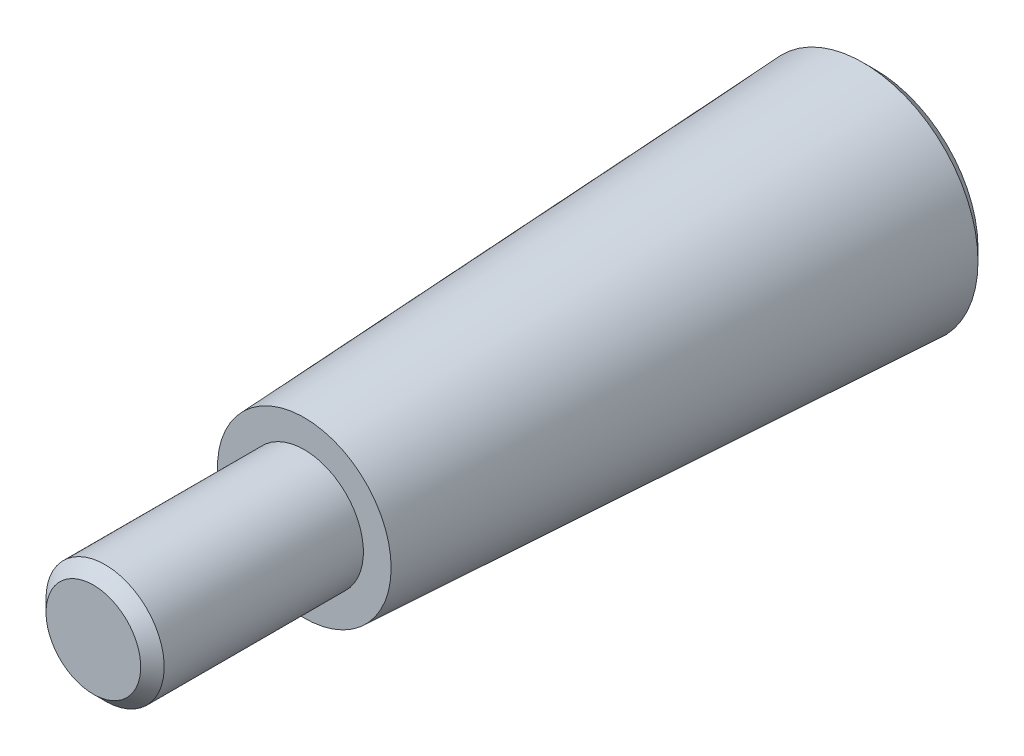
ISO-10303-21;
HEADER;
FILE_DESCRIPTION(('STEP AP214'),'2;1');
FILE_NAME('part.step','',(''),(''),'','','');
FILE_SCHEMA(('AUTOMOTIVE_DESIGN { 1 0 10303 214 1 1 1 1 }'));
ENDSEC;
DATA;
#1=APPLICATION_CONTEXT('core data for automotive mechanical design processes');
#2=APPLICATION_PROTOCOL_DEFINITION('international standard','automotive_design',2000,#1);
#3=PRODUCT_CONTEXT('',#1,'mechanical');
#4=PRODUCT('Part','Part','',(#3));
#5=PRODUCT_RELATED_PRODUCT_CATEGORY('part','',(#4));
#6=PRODUCT_DEFINITION_FORMATION('','',#4);
#7=PRODUCT_DEFINITION_CONTEXT('part definition',#1,'design');
#8=PRODUCT_DEFINITION('design','',#6,#7);
#9=PRODUCT_DEFINITION_SHAPE('','',#8);
#10=(LENGTH_UNIT() NAMED_UNIT(*) SI_UNIT(.MILLI.,.METRE.));
#11=(NAMED_UNIT(*) PLANE_ANGLE_UNIT() SI_UNIT($,.RADIAN.));
#12=(NAMED_UNIT(*) SI_UNIT($,.STERADIAN.) SOLID_ANGLE_UNIT());
#13=UNCERTAINTY_MEASURE_WITH_UNIT(LENGTH_MEASURE(1.E-05),#10,'distance_accuracy_value','');
#14=(GEOMETRIC_REPRESENTATION_CONTEXT(3) GLOBAL_UNCERTAINTY_ASSIGNED_CONTEXT((#13)) GLOBAL_UNIT_ASSIGNED_CONTEXT((#10,
#11,#12)) REPRESENTATION_CONTEXT('',''));
#15=CARTESIAN_POINT('',(0.,0.,0.));
#16=DIRECTION('',(0.,0.,1.));
#17=DIRECTION('',(1.,0.,0.));
#18=AXIS2_PLACEMENT_3D('',#15,#16,#17);
#19=CARTESIAN_POINT('',(0.,0.,0.));
#20=DIRECTION('',(0.,0.,1.));
#21=DIRECTION('',(1.,0.,0.));
#22=AXIS2_PLACEMENT_3D('',#19,#20,#21);
#23=PLANE('',#22);
#24=CARTESIAN_POINT('',(0.,0.,0.));
#25=DIRECTION('',(0.,0.,-1.));
#26=DIRECTION('',(-1.,0.,0.));
#27=AXIS2_PLACEMENT_3D('',#24,#25,#26);
#28=CIRCLE('',#27,3.81635);
#29=CARTESIAN_POINT('',(-3.81635,0.,0.));
#30=VERTEX_POINT('',#29);
#31=EDGE_CURVE('E66',#30,#30,#28,.T.);
#32=ORIENTED_EDGE('',*,*,#31,.F.);
#33=EDGE_LOOP('',(#32));
#34=FACE_BOUND('',#33,.T.);
#35=ADVANCED_FACE('F47',(#34),#23,.T.);
#36=CARTESIAN_POINT('',(0.,0.,0.));
#37=DIRECTION('',(0.,0.,-1.));
#38=DIRECTION('',(-1.,0.,0.));
#39=AXIS2_PLACEMENT_3D('',#36,#37,#38);
#40=CYLINDRICAL_SURFACE('',#39,4.7625);
#41=CARTESIAN_POINT('',(0.,0.,-17.));
#42=DIRECTION('',(0.,0.,-1.));
#43=DIRECTION('',(-1.,0.,0.));
#44=AXIS2_PLACEMENT_3D('',#41,#42,#43);
#45=CIRCLE('',#44,4.7625);
#46=CARTESIAN_POINT('',(-4.7625,0.,-17.));
#47=VERTEX_POINT('',#46);
#48=EDGE_CURVE('E61',#47,#47,#45,.T.);
#49=ORIENTED_EDGE('',*,*,#48,.F.);
#50=EDGE_LOOP('',(#49));
#51=FACE_BOUND('',#50,.T.);
#52=CARTESIAN_POINT('',(0.,0.,-0.946149999999986));
#53=DIRECTION('',(0.,0.,-1.));
#54=DIRECTION('',(-1.,0.,0.));
#55=AXIS2_PLACEMENT_3D('',#52,#53,#54);
#56=CIRCLE('',#55,4.7625);
#57=CARTESIAN_POINT('',(-4.7625,0.,-0.946149999999986));
#58=VERTEX_POINT('',#57);
#59=EDGE_CURVE('E72',#58,#58,#56,.T.);
#60=ORIENTED_EDGE('',*,*,#59,.T.);
#61=EDGE_LOOP('',(#60));
#62=FACE_BOUND('',#61,.T.);
#63=ADVANCED_FACE('F96',(#51,#62),#40,.T.);
#64=CARTESIAN_POINT('',(0.,0.,0.));
#65=DIRECTION('',(0.,0.,-1.));
#66=DIRECTION('',(-1.,0.,0.));
#67=AXIS2_PLACEMENT_3D('',#64,#65,#66);
#68=CONICAL_SURFACE('',#67,3.81635,0.785398163397455);
#69=ORIENTED_EDGE('',*,*,#59,.F.);
#70=EDGE_LOOP('',(#69));
#71=FACE_BOUND('',#70,.T.);
#72=ORIENTED_EDGE('',*,*,#31,.T.);
#73=EDGE_LOOP('',(#72));
#74=FACE_BOUND('',#73,.T.);
#75=ADVANCED_FACE('F92',(#71,#74),#68,.T.);
#76=CARTESIAN_POINT('',(0.,0.,-17.));
#77=DIRECTION('',(0.,0.,-1.));
#78=DIRECTION('',(-1.,0.,0.));
#79=AXIS2_PLACEMENT_3D('',#76,#77,#78);
#80=PLANE('',#79);
#81=ORIENTED_EDGE('',*,*,#48,.T.);
#82=EDGE_LOOP('',(#81));
#83=FACE_BOUND('',#82,.T.);
#84=CARTESIAN_POINT('',(0.,0.,-17.));
#85=DIRECTION('',(0.,0.,1.));
#86=DIRECTION('',(1.,0.,0.));
#87=AXIS2_PLACEMENT_3D('',#84,#85,#86);
#88=CIRCLE('',#87,7.);
#89=CARTESIAN_POINT('',(7.,0.,-17.));
#90=VERTEX_POINT('',#89);
#91=EDGE_CURVE('E76',#90,#90,#88,.T.);
#92=ORIENTED_EDGE('',*,*,#91,.T.);
#93=EDGE_LOOP('',(#92));
#94=FACE_BOUND('',#93,.T.);
#95=ADVANCED_FACE('F81',(#83,#94),#80,.F.);
#96=CARTESIAN_POINT('',(0.,0.,-63.));
#97=DIRECTION('',(0.,0.,-1.));
#98=DIRECTION('',(-1.,0.,0.));
#99=AXIS2_PLACEMENT_3D('',#96,#97,#98);
#100=CONICAL_SURFACE('',#99,9.3,0.0499583957219427);
#101=CARTESIAN_POINT('',(0.,0.,-62.047619047619));
#102=DIRECTION('',(0.,0.,1.));
#103=DIRECTION('',(1.,0.,0.));
#104=AXIS2_PLACEMENT_3D('',#101,#102,#103);
#105=CIRCLE('',#104,9.25238095238095);
#106=CARTESIAN_POINT('',(9.25238095238098,0.,-62.047619047619));
#107=VERTEX_POINT('',#106);
#108=EDGE_CURVE('E56',#107,#107,#105,.T.);
#109=ORIENTED_EDGE('',*,*,#108,.T.);
#110=EDGE_LOOP('',(#109));
#111=FACE_BOUND('',#110,.T.);
#112=ORIENTED_EDGE('',*,*,#91,.F.);
#113=EDGE_LOOP('',(#112));
#114=FACE_BOUND('',#113,.T.);
#115=ADVANCED_FACE('F83',(#111,#114),#100,.T.);
#116=CARTESIAN_POINT('',(0.,9.3,-63.));
#117=DIRECTION('',(0.,0.,1.));
#118=DIRECTION('',(1.,0.,0.));
#119=AXIS2_PLACEMENT_3D('',#116,#117,#118);
#120=PLANE('',#119);
#121=CARTESIAN_POINT('',(0.,0.,-63.));
#122=DIRECTION('',(0.,0.,1.));
#123=DIRECTION('',(1.,0.,0.));
#124=AXIS2_PLACEMENT_3D('',#121,#122,#123);
#125=CIRCLE('',#124,8.3);
#126=CARTESIAN_POINT('',(8.29999999999999,0.,-63.));
#127=VERTEX_POINT('',#126);
#128=EDGE_CURVE('E10',#127,#127,#125,.F.);
#129=ORIENTED_EDGE('',*,*,#128,.T.);
#130=EDGE_LOOP('',(#129));
#131=FACE_BOUND('',#130,.T.);
#132=ADVANCED_FACE('F85',(#131),#120,.F.);
#133=CARTESIAN_POINT('',(0.,0.,-62.047619047619));
#134=DIRECTION('',(0.,0.,1.));
#135=DIRECTION('',(1.,0.,0.));
#136=AXIS2_PLACEMENT_3D('',#133,#134,#135);
#137=CONICAL_SURFACE('',#136,9.25238095238095,0.785398163397447);
#138=CARTESIAN_POINT('',(8.29999999999999,0.,-63.));
#139=CARTESIAN_POINT('',(8.30992063492063,0.,-62.9900793650794));
#140=CARTESIAN_POINT('',(8.31984126984126,0.,-62.9801587301587));
#141=CARTESIAN_POINT('',(8.33968253968253,0.,-62.9603174603175));
#142=CARTESIAN_POINT('',(8.34960317460317,0.,-62.9503968253968));
#143=CARTESIAN_POINT('',(8.36944444444444,0.,-62.9305555555556));
#144=CARTESIAN_POINT('',(8.37936507936507,0.,-62.9206349206349));
#145=CARTESIAN_POINT('',(8.39920634920635,0.,-62.9007936507937));
#146=CARTESIAN_POINT('',(8.40912698412698,0.,-62.890873015873));
#147=CARTESIAN_POINT('',(8.42896825396825,0.,-62.8710317460317));
#148=CARTESIAN_POINT('',(8.43888888888889,0.,-62.8611111111111));
#149=CARTESIAN_POINT('',(8.45873015873016,0.,-62.8412698412698));
#150=CARTESIAN_POINT('',(8.46865079365079,0.,-62.8313492063492));
#151=CARTESIAN_POINT('',(8.48849206349206,0.,-62.8115079365079));
#152=CARTESIAN_POINT('',(8.4984126984127,0.,-62.8015873015873));
#153=CARTESIAN_POINT('',(8.51825396825397,0.,-62.781746031746));
#154=CARTESIAN_POINT('',(8.5281746031746,0.,-62.7718253968254));
#155=CARTESIAN_POINT('',(8.54801587301587,0.,-62.7519841269841));
#156=CARTESIAN_POINT('',(8.55793650793651,0.,-62.7420634920635));
#157=CARTESIAN_POINT('',(8.57777777777778,0.,-62.7222222222222));
#158=CARTESIAN_POINT('',(8.58769841269842,0.,-62.7123015873016));
#159=CARTESIAN_POINT('',(8.60753968253969,0.,-62.6924603174603));
#160=CARTESIAN_POINT('',(8.61746031746032,0.,-62.6825396825397));
#161=CARTESIAN_POINT('',(8.63730158730159,0.,-62.6626984126984));
#162=CARTESIAN_POINT('',(8.64722222222223,0.,-62.6527777777778));
#163=CARTESIAN_POINT('',(8.6670634920635,0.,-62.6329365079365));
#164=CARTESIAN_POINT('',(8.67698412698413,0.,-62.6230158730159));
#165=CARTESIAN_POINT('',(8.6968253968254,0.,-62.6031746031746));
#166=CARTESIAN_POINT('',(8.70674603174604,0.,-62.593253968254));
#167=CARTESIAN_POINT('',(8.72658730158731,0.,-62.5734126984127));
#168=CARTESIAN_POINT('',(8.73650793650794,0.,-62.5634920634921));
#169=CARTESIAN_POINT('',(8.75634920634921,0.,-62.5436507936508));
#170=CARTESIAN_POINT('',(8.76626984126985,0.,-62.5337301587302));
#171=CARTESIAN_POINT('',(8.78611111111112,0.,-62.5138888888889));
#172=CARTESIAN_POINT('',(8.79603174603175,0.,-62.5039682539682));
#173=CARTESIAN_POINT('',(8.81587301587303,0.,-62.484126984127));
#174=CARTESIAN_POINT('',(8.82579365079366,0.,-62.4742063492063));
#175=CARTESIAN_POINT('',(8.84563492063493,0.,-62.4543650793651));
#176=CARTESIAN_POINT('',(8.85555555555557,0.,-62.4444444444444));
#177=CARTESIAN_POINT('',(8.87539682539684,0.,-62.4246031746032));
#178=CARTESIAN_POINT('',(8.88531746031747,0.,-62.4146825396825));
#179=CARTESIAN_POINT('',(8.90515873015874,0.,-62.3948412698413));
#180=CARTESIAN_POINT('',(8.91507936507938,0.,-62.3849206349206));
#181=CARTESIAN_POINT('',(8.93492063492065,0.,-62.3650793650794));
#182=CARTESIAN_POINT('',(8.94484126984129,0.,-62.3551587301587));
#183=CARTESIAN_POINT('',(8.96468253968256,0.,-62.3353174603174));
#184=CARTESIAN_POINT('',(8.97460317460319,0.,-62.3253968253968));
#185=CARTESIAN_POINT('',(8.99444444444446,0.,-62.3055555555555));
#186=CARTESIAN_POINT('',(9.0043650793651,0.,-62.2956349206349));
#187=CARTESIAN_POINT('',(9.02420634920637,0.,-62.2757936507936));
#188=CARTESIAN_POINT('',(9.034126984127,0.,-62.265873015873));
#189=CARTESIAN_POINT('',(9.05396825396827,0.,-62.2460317460317));
#190=CARTESIAN_POINT('',(9.06388888888891,0.,-62.2361111111111));
#191=CARTESIAN_POINT('',(9.08373015873018,0.,-62.2162698412698));
#192=CARTESIAN_POINT('',(9.09365079365081,0.,-62.2063492063492));
#193=CARTESIAN_POINT('',(9.11349206349208,0.,-62.1865079365079));
#194=CARTESIAN_POINT('',(9.12341269841272,0.,-62.1765873015873));
#195=CARTESIAN_POINT('',(9.14325396825399,0.,-62.156746031746));
#196=CARTESIAN_POINT('',(9.15317460317462,0.,-62.1468253968254));
#197=CARTESIAN_POINT('',(9.1730158730159,0.,-62.1269841269841));
#198=CARTESIAN_POINT('',(9.18293650793653,0.,-62.1170634920635));
#199=CARTESIAN_POINT('',(9.2027777777778,0.,-62.0972222222222));
#200=CARTESIAN_POINT('',(9.21269841269844,0.,-62.0873015873016));
#201=CARTESIAN_POINT('',(9.23253968253971,0.,-62.0674603174603));
#202=CARTESIAN_POINT('',(9.24246031746034,0.,-62.0575396825397));
#203=CARTESIAN_POINT('',(9.25238095238098,0.,-62.047619047619));
#204=B_SPLINE_CURVE_WITH_KNOTS('',3,(#138,#139,#140,#141,#142,#143,#144,#145,#146,#147,#148,
#149,#150,#151,#152,#153,#154,#155,#156,#157,#158,#159,#160,#161,#162,#163,#164,#165,#166,#167,
#168,#169,#170,#171,#172,#173,#174,#175,#176,#177,#178,#179,#180,#181,#182,#183,#184,#185,#186,
#187,#188,#189,#190,#191,#192,#193,#194,#195,#196,#197,#198,#199,#200,#201,#202,#203),
.UNSPECIFIED.,.F.,.F.,(4,2,2,2,2,2,2,2,2,2,2,2,2,2,2,2,2,2,2,2,2,2,2,2,2,2,2,2,2,2,2,2,4),(0.,
0.0420896893563447,0.0841793787126893,0.126269068069034,0.168358757425379,0.210448446781723,
0.252538136138068,0.294627825494413,0.336717514850757,0.378807204207092,0.420896893563437,
0.462986582919782,0.505076272276126,0.547165961632471,0.589255650988815,0.63134534034516,
0.673435029701505,0.715524719057844,0.75761440841419,0.799704097770535,0.841793787126875,
0.883883476483219,0.925973165839564,0.968062855195908,1.01015254455225,1.05224223390859,
1.09433192326494,1.13642161262128,1.17851130197762,1.22060099133397,1.26269068069031,
1.30478037004666,1.346870059403),.UNSPECIFIED.);
#205=EDGE_CURVE('BSEAM50',#127,#107,#204,.T.);
#206=ORIENTED_EDGE('',*,*,#128,.F.);
#207=ORIENTED_EDGE('',*,*,#108,.F.);
#208=ORIENTED_EDGE('',*,*,#205,.T.);
#209=ORIENTED_EDGE('',*,*,#205,.F.);
#210=EDGE_LOOP('',(#206,#208,#207,#209));
#211=FACE_BOUND('',#210,.T.);
#212=ADVANCED_FACE('F50',(#211),#137,.T.);
#213=CLOSED_SHELL('',(#35,#63,#75,#95,#115,#132,#212));
#214=MANIFOLD_SOLID_BREP('B2',#213);
#215=ADVANCED_BREP_SHAPE_REPRESENTATION('',(#18,#214),#14);
#216=SHAPE_DEFINITION_REPRESENTATION(#9,#215);
ENDSEC;
END-ISO-10303-21;
